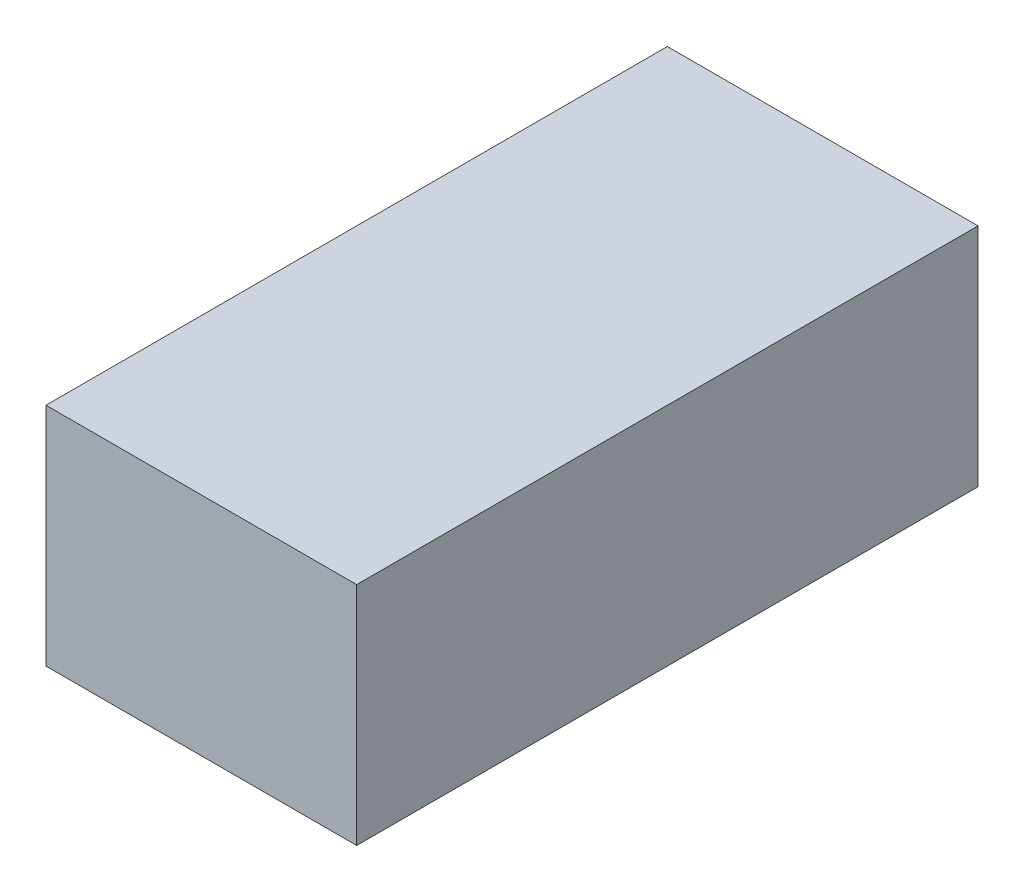
ISO-10303-21;
HEADER;
FILE_DESCRIPTION(('STEP AP214'),'2;1');
FILE_NAME('part.step','',(''),(''),'','','');
FILE_SCHEMA(('AUTOMOTIVE_DESIGN { 1 0 10303 214 1 1 1 1 }'));
ENDSEC;
DATA;
#1=APPLICATION_CONTEXT('core data for automotive mechanical design processes');
#2=APPLICATION_PROTOCOL_DEFINITION('international standard','automotive_design',2000,#1);
#3=PRODUCT_CONTEXT('',#1,'mechanical');
#4=PRODUCT('Part','Part','',(#3));
#5=PRODUCT_RELATED_PRODUCT_CATEGORY('part','',(#4));
#6=PRODUCT_DEFINITION_FORMATION('','',#4);
#7=PRODUCT_DEFINITION_CONTEXT('part definition',#1,'design');
#8=PRODUCT_DEFINITION('design','',#6,#7);
#9=PRODUCT_DEFINITION_SHAPE('','',#8);
#10=(LENGTH_UNIT() NAMED_UNIT(*) SI_UNIT(.MILLI.,.METRE.));
#11=(NAMED_UNIT(*) PLANE_ANGLE_UNIT() SI_UNIT($,.RADIAN.));
#12=(NAMED_UNIT(*) SI_UNIT($,.STERADIAN.) SOLID_ANGLE_UNIT());
#13=UNCERTAINTY_MEASURE_WITH_UNIT(LENGTH_MEASURE(1.E-05),#10,'distance_accuracy_value','');
#14=(GEOMETRIC_REPRESENTATION_CONTEXT(3) GLOBAL_UNCERTAINTY_ASSIGNED_CONTEXT((#13)) GLOBAL_UNIT_ASSIGNED_CONTEXT((#10,
#11,#12)) REPRESENTATION_CONTEXT('',''));
#15=CARTESIAN_POINT('',(0.,0.,0.));
#16=DIRECTION('',(0.,0.,1.));
#17=DIRECTION('',(1.,0.,0.));
#18=AXIS2_PLACEMENT_3D('',#15,#16,#17);
#19=CARTESIAN_POINT('',(27.5,40.,-55.));
#20=DIRECTION('',(-1.,0.,0.));
#21=DIRECTION('',(0.,0.,1.));
#22=AXIS2_PLACEMENT_3D('',#19,#20,#21);
#23=PLANE('',#22);
#24=DIRECTION('',(0.,0.,-1.));
#25=VECTOR('',#24,1.);
#26=CARTESIAN_POINT('',(27.5,0.,-55.));
#27=LINE('',#26,#25);
#28=CARTESIAN_POINT('',(27.5,0.,55.));
#29=VERTEX_POINT('',#28);
#30=CARTESIAN_POINT('',(27.5,0.,-55.));
#31=VERTEX_POINT('',#30);
#32=EDGE_CURVE('E98',#29,#31,#27,.T.);
#33=ORIENTED_EDGE('',*,*,#32,.T.);
#34=DIRECTION('',(0.,-1.,0.));
#35=VECTOR('',#34,1.);
#36=CARTESIAN_POINT('',(27.5,40.,-55.));
#37=LINE('',#36,#35);
#38=CARTESIAN_POINT('',(27.5,40.,-55.));
#39=VERTEX_POINT('',#38);
#40=EDGE_CURVE('E11',#39,#31,#37,.T.);
#41=ORIENTED_EDGE('',*,*,#40,.F.);
#42=DIRECTION('',(0.,0.,-1.));
#43=VECTOR('',#42,1.);
#44=CARTESIAN_POINT('',(27.5,40.,-55.));
#45=LINE('',#44,#43);
#46=CARTESIAN_POINT('',(27.5,40.,55.));
#47=VERTEX_POINT('',#46);
#48=EDGE_CURVE('E86',#47,#39,#45,.T.);
#49=ORIENTED_EDGE('',*,*,#48,.F.);
#50=DIRECTION('',(0.,-1.,0.));
#51=VECTOR('',#50,1.);
#52=CARTESIAN_POINT('',(27.5,40.,55.));
#53=LINE('',#52,#51);
#54=EDGE_CURVE('E94',#47,#29,#53,.T.);
#55=ORIENTED_EDGE('',*,*,#54,.T.);
#56=EDGE_LOOP('',(#33,#41,#49,#55));
#57=FACE_BOUND('',#56,.T.);
#58=ADVANCED_FACE('F35',(#57),#23,.F.);
#59=CARTESIAN_POINT('',(-27.5,40.,-55.));
#60=DIRECTION('',(0.,0.,1.));
#61=DIRECTION('',(1.,0.,0.));
#62=AXIS2_PLACEMENT_3D('',#59,#60,#61);
#63=PLANE('',#62);
#64=DIRECTION('',(-1.,0.,0.));
#65=VECTOR('',#64,1.);
#66=CARTESIAN_POINT('',(-27.5,0.,-55.));
#67=LINE('',#66,#65);
#68=CARTESIAN_POINT('',(-27.5,0.,-55.));
#69=VERTEX_POINT('',#68);
#70=EDGE_CURVE('E90',#31,#69,#67,.T.);
#71=ORIENTED_EDGE('',*,*,#70,.T.);
#72=DIRECTION('',(0.,-1.,0.));
#73=VECTOR('',#72,1.);
#74=CARTESIAN_POINT('',(-27.5,40.,-55.));
#75=LINE('',#74,#73);
#76=CARTESIAN_POINT('',(-27.5,40.,-55.));
#77=VERTEX_POINT('',#76);
#78=EDGE_CURVE('E43',#77,#69,#75,.T.);
#79=ORIENTED_EDGE('',*,*,#78,.F.);
#80=DIRECTION('',(-1.,0.,0.));
#81=VECTOR('',#80,1.);
#82=CARTESIAN_POINT('',(-27.5,40.,-55.));
#83=LINE('',#82,#81);
#84=EDGE_CURVE('E81',#39,#77,#83,.T.);
#85=ORIENTED_EDGE('',*,*,#84,.F.);
#86=ORIENTED_EDGE('',*,*,#40,.T.);
#87=EDGE_LOOP('',(#71,#79,#85,#86));
#88=FACE_BOUND('',#87,.T.);
#89=ADVANCED_FACE('F89',(#88),#63,.F.);
#90=CARTESIAN_POINT('',(-27.5,40.,-55.));
#91=DIRECTION('',(1.,0.,0.));
#92=DIRECTION('',(0.,0.,-1.));
#93=AXIS2_PLACEMENT_3D('',#90,#91,#92);
#94=PLANE('',#93);
#95=DIRECTION('',(0.,0.,1.));
#96=VECTOR('',#95,1.);
#97=CARTESIAN_POINT('',(-27.5,0.,-55.));
#98=LINE('',#97,#96);
#99=CARTESIAN_POINT('',(-27.5,0.,55.));
#100=VERTEX_POINT('',#99);
#101=EDGE_CURVE('E68',#69,#100,#98,.T.);
#102=ORIENTED_EDGE('',*,*,#101,.T.);
#103=DIRECTION('',(0.,-1.,0.));
#104=VECTOR('',#103,1.);
#105=CARTESIAN_POINT('',(-27.5,40.,55.));
#106=LINE('',#105,#104);
#107=CARTESIAN_POINT('',(-27.5,40.,55.));
#108=VERTEX_POINT('',#107);
#109=EDGE_CURVE('E91',#108,#100,#106,.T.);
#110=ORIENTED_EDGE('',*,*,#109,.F.);
#111=DIRECTION('',(0.,0.,1.));
#112=VECTOR('',#111,1.);
#113=CARTESIAN_POINT('',(-27.5,40.,-55.));
#114=LINE('',#113,#112);
#115=EDGE_CURVE('E84',#77,#108,#114,.T.);
#116=ORIENTED_EDGE('',*,*,#115,.F.);
#117=ORIENTED_EDGE('',*,*,#78,.T.);
#118=EDGE_LOOP('',(#102,#110,#116,#117));
#119=FACE_BOUND('',#118,.T.);
#120=ADVANCED_FACE('F92',(#119),#94,.F.);
#121=CARTESIAN_POINT('',(-27.5,40.,55.));
#122=DIRECTION('',(0.,0.,-1.));
#123=DIRECTION('',(-1.,0.,0.));
#124=AXIS2_PLACEMENT_3D('',#121,#122,#123);
#125=PLANE('',#124);
#126=DIRECTION('',(1.,0.,0.));
#127=VECTOR('',#126,1.);
#128=CARTESIAN_POINT('',(-27.5,0.,55.));
#129=LINE('',#128,#127);
#130=EDGE_CURVE('E74',#100,#29,#129,.T.);
#131=ORIENTED_EDGE('',*,*,#130,.T.);
#132=ORIENTED_EDGE('',*,*,#54,.F.);
#133=DIRECTION('',(1.,0.,0.));
#134=VECTOR('',#133,1.);
#135=CARTESIAN_POINT('',(-27.5,40.,55.));
#136=LINE('',#135,#134);
#137=EDGE_CURVE('E51',#108,#47,#136,.T.);
#138=ORIENTED_EDGE('',*,*,#137,.F.);
#139=ORIENTED_EDGE('',*,*,#109,.T.);
#140=EDGE_LOOP('',(#131,#132,#138,#139));
#141=FACE_BOUND('',#140,.T.);
#142=ADVANCED_FACE('F105',(#141),#125,.F.);
#143=CARTESIAN_POINT('',(0.,40.,0.));
#144=DIRECTION('',(0.,1.,0.));
#145=DIRECTION('',(0.,0.,1.));
#146=AXIS2_PLACEMENT_3D('',#143,#144,#145);
#147=PLANE('',#146);
#148=ORIENTED_EDGE('',*,*,#48,.T.);
#149=ORIENTED_EDGE('',*,*,#84,.T.);
#150=ORIENTED_EDGE('',*,*,#115,.T.);
#151=ORIENTED_EDGE('',*,*,#137,.T.);
#152=EDGE_LOOP('',(#148,#149,#150,#151));
#153=FACE_BOUND('',#152,.T.);
#154=ADVANCED_FACE('F82',(#153),#147,.T.);
#155=CARTESIAN_POINT('',(0.,0.,0.));
#156=DIRECTION('',(0.,1.,0.));
#157=DIRECTION('',(0.,0.,1.));
#158=AXIS2_PLACEMENT_3D('',#155,#156,#157);
#159=PLANE('',#158);
#160=ORIENTED_EDGE('',*,*,#32,.F.);
#161=ORIENTED_EDGE('',*,*,#130,.F.);
#162=ORIENTED_EDGE('',*,*,#101,.F.);
#163=ORIENTED_EDGE('',*,*,#70,.F.);
#164=EDGE_LOOP('',(#160,#161,#162,#163));
#165=FACE_BOUND('',#164,.T.);
#166=ADVANCED_FACE('F108',(#165),#159,.F.);
#167=CLOSED_SHELL('',(#58,#89,#120,#142,#154,#166));
#168=MANIFOLD_SOLID_BREP('B2',#167);
#169=ADVANCED_BREP_SHAPE_REPRESENTATION('',(#18,#168),#14);
#170=SHAPE_DEFINITION_REPRESENTATION(#9,#169);
ENDSEC;
END-ISO-10303-21;
